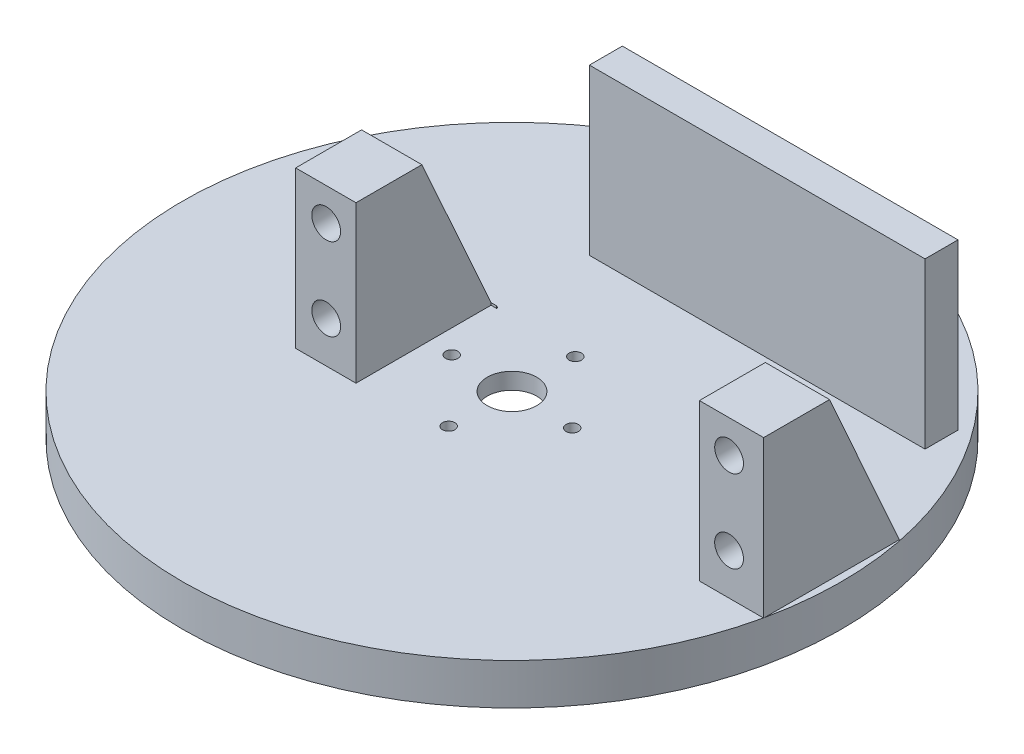
ISO-10303-21;
HEADER;
FILE_DESCRIPTION(('STEP AP214'),'2;1');
FILE_NAME('part.step','',(''),(''),'','','');
FILE_SCHEMA(('AUTOMOTIVE_DESIGN { 1 0 10303 214 1 1 1 1 }'));
ENDSEC;
DATA;
#1=APPLICATION_CONTEXT('core data for automotive mechanical design processes');
#2=APPLICATION_PROTOCOL_DEFINITION('international standard','automotive_design',2000,#1);
#3=PRODUCT_CONTEXT('',#1,'mechanical');
#4=PRODUCT('Part','Part','',(#3));
#5=PRODUCT_RELATED_PRODUCT_CATEGORY('part','',(#4));
#6=PRODUCT_DEFINITION_FORMATION('','',#4);
#7=PRODUCT_DEFINITION_CONTEXT('part definition',#1,'design');
#8=PRODUCT_DEFINITION('design','',#6,#7);
#9=PRODUCT_DEFINITION_SHAPE('','',#8);
#10=(LENGTH_UNIT() NAMED_UNIT(*) SI_UNIT(.MILLI.,.METRE.));
#11=(NAMED_UNIT(*) PLANE_ANGLE_UNIT() SI_UNIT($,.RADIAN.));
#12=(NAMED_UNIT(*) SI_UNIT($,.STERADIAN.) SOLID_ANGLE_UNIT());
#13=UNCERTAINTY_MEASURE_WITH_UNIT(LENGTH_MEASURE(1.E-05),#10,'distance_accuracy_value','');
#14=(GEOMETRIC_REPRESENTATION_CONTEXT(3) GLOBAL_UNCERTAINTY_ASSIGNED_CONTEXT((#13)) GLOBAL_UNIT_ASSIGNED_CONTEXT((#10,
#11,#12)) REPRESENTATION_CONTEXT('',''));
#15=CARTESIAN_POINT('',(0.,0.,0.));
#16=DIRECTION('',(0.,0.,1.));
#17=DIRECTION('',(1.,0.,0.));
#18=AXIS2_PLACEMENT_3D('',#15,#16,#17);
#19=CARTESIAN_POINT('',(-9.64954758475133,23.97,8.60418457702042));
#20=DIRECTION('',(-1.,0.,0.));
#21=DIRECTION('',(0.,0.,1.));
#22=AXIS2_PLACEMENT_3D('',#19,#20,#21);
#23=PLANE('',#22);
#24=DIRECTION('',(0.,1.,0.));
#25=VECTOR('',#24,1.);
#26=CARTESIAN_POINT('',(-9.64954758475133,23.97,-7.78581542297958));
#27=LINE('',#26,#25);
#28=CARTESIAN_POINT('',(-9.64954758475133,5.,-7.78581542297958));
#29=VERTEX_POINT('',#28);
#30=CARTESIAN_POINT('',(-9.64954758475133,5.28005768198521,-7.78581542297958));
#31=VERTEX_POINT('',#30);
#32=EDGE_CURVE('E57',#29,#31,#27,.T.);
#33=ORIENTED_EDGE('',*,*,#32,.F.);
#34=DIRECTION('',(0.,0.,-1.));
#35=VECTOR('',#34,1.);
#36=CARTESIAN_POINT('',(-9.64954758475133,5.,8.60418457702042));
#37=LINE('',#36,#35);
#38=CARTESIAN_POINT('',(-9.64954758475133,5.00000000000001,-7.91153458850054));
#39=VERTEX_POINT('',#38);
#40=EDGE_CURVE('E174',#29,#39,#37,.T.);
#41=ORIENTED_EDGE('',*,*,#40,.T.);
#42=DIRECTION('',(0.,-0.912295115124225,-0.40953342100551));
#43=VECTOR('',#42,1.);
#44=CARTESIAN_POINT('',(-9.64954758475133,23.97,0.604184577020423));
#45=LINE('',#44,#43);
#46=EDGE_CURVE('E242',#31,#39,#45,.T.);
#47=ORIENTED_EDGE('',*,*,#46,.F.);
#48=EDGE_LOOP('',(#33,#41,#47));
#49=FACE_BOUND('',#48,.T.);
#50=ADVANCED_FACE('F35',(#49),#23,.F.);
#51=CARTESIAN_POINT('',(0.,5.,0.));
#52=DIRECTION('',(0.,1.,0.));
#53=DIRECTION('',(0.,0.,1.));
#54=AXIS2_PLACEMENT_3D('',#51,#52,#53);
#55=PLANE('',#54);
#56=ORIENTED_EDGE('',*,*,#40,.F.);
#57=DIRECTION('',(1.,0.,0.));
#58=VECTOR('',#57,1.);
#59=CARTESIAN_POINT('',(-9.60121281858979,5.,-7.78581542297958));
#60=LINE('',#59,#58);
#61=CARTESIAN_POINT('',(-10.328641300271,5.,-7.78581542297958));
#62=VERTEX_POINT('',#61);
#63=EDGE_CURVE('E156',#62,#29,#60,.T.);
#64=ORIENTED_EDGE('',*,*,#63,.F.);
#65=DIRECTION('',(0.,0.,1.));
#66=VECTOR('',#65,1.);
#67=CARTESIAN_POINT('',(-10.328641300271,5.,-7.78581542297958));
#68=LINE('',#67,#66);
#69=CARTESIAN_POINT('',(-10.328641300271,5.,8.60418457702042));
#70=VERTEX_POINT('',#69);
#71=EDGE_CURVE('E163',#62,#70,#68,.T.);
#72=ORIENTED_EDGE('',*,*,#71,.T.);
#73=DIRECTION('',(1.,0.,0.));
#74=VECTOR('',#73,1.);
#75=CARTESIAN_POINT('',(-9.64954758475133,5.,8.60418457702042));
#76=LINE('',#75,#74);
#77=CARTESIAN_POINT('',(-17.6495475847513,5.,8.60418457702042));
#78=VERTEX_POINT('',#77);
#79=EDGE_CURVE('E283',#78,#70,#76,.T.);
#80=ORIENTED_EDGE('',*,*,#79,.F.);
#81=DIRECTION('',(0.,0.,1.));
#82=VECTOR('',#81,1.);
#83=CARTESIAN_POINT('',(-17.6495475847513,5.,8.60418457702042));
#84=LINE('',#83,#82);
#85=CARTESIAN_POINT('',(-17.6495475847513,5.00000000000001,-7.91153458850054));
#86=VERTEX_POINT('',#85);
#87=EDGE_CURVE('E290',#86,#78,#84,.T.);
#88=ORIENTED_EDGE('',*,*,#87,.F.);
#89=DIRECTION('',(-1.,0.,0.));
#90=VECTOR('',#89,1.);
#91=CARTESIAN_POINT('',(-9.64954758475133,5.00000000000001,-7.91153458850054));
#92=LINE('',#91,#90);
#93=EDGE_CURVE('E245',#39,#86,#92,.T.);
#94=ORIENTED_EDGE('',*,*,#93,.F.);
#95=EDGE_LOOP('',(#56,#64,#72,#80,#88,#94));
#96=FACE_BOUND('',#95,.T.);
#97=DIRECTION('',(1.,0.,0.));
#98=VECTOR('',#97,1.);
#99=CARTESIAN_POINT('',(31.0987871814103,5.,8.55500077628189));
#100=LINE('',#99,#98);
#101=CARTESIAN_POINT('',(31.30512446495,5.,8.5550007762819));
#102=VERTEX_POINT('',#101);
#103=CARTESIAN_POINT('',(39.0744412847812,5.,8.55500077628189));
#104=VERTEX_POINT('',#103);
#105=EDGE_CURVE('E273',#102,#104,#100,.T.);
#106=ORIENTED_EDGE('',*,*,#105,.F.);
#107=DIRECTION('',(0.,0.,1.));
#108=VECTOR('',#107,1.);
#109=CARTESIAN_POINT('',(31.30512446495,5.,-7.78581542297958));
#110=LINE('',#109,#108);
#111=CARTESIAN_POINT('',(31.30512446495,5.,-7.78581542297958));
#112=VERTEX_POINT('',#111);
#113=EDGE_CURVE('E177',#112,#102,#110,.T.);
#114=ORIENTED_EDGE('',*,*,#113,.F.);
#115=DIRECTION('',(1.,0.,0.));
#116=VECTOR('',#115,1.);
#117=CARTESIAN_POINT('',(31.0987871814103,5.,-7.78581542297958));
#118=LINE('',#117,#116);
#119=CARTESIAN_POINT('',(31.0987871814103,5.,-7.78581542297958));
#120=VERTEX_POINT('',#119);
#121=EDGE_CURVE('E181',#120,#112,#118,.T.);
#122=ORIENTED_EDGE('',*,*,#121,.F.);
#123=DIRECTION('',(0.,0.,1.));
#124=VECTOR('',#123,1.);
#125=CARTESIAN_POINT('',(31.0987871814103,5.,8.55500077628189));
#126=LINE('',#125,#124);
#127=CARTESIAN_POINT('',(31.0987871814103,5.00000000000001,-7.91153458850054));
#128=VERTEX_POINT('',#127);
#129=EDGE_CURVE('E259',#128,#120,#126,.T.);
#130=ORIENTED_EDGE('',*,*,#129,.F.);
#131=DIRECTION('',(1.,0.,0.));
#132=VECTOR('',#131,1.);
#133=CARTESIAN_POINT('',(31.0987871814103,5.00000000000001,-7.91153458850054));
#134=LINE('',#133,#132);
#135=CARTESIAN_POINT('',(39.0987871814103,5.00000000000001,-7.91153458850054));
#136=VERTEX_POINT('',#135);
#137=EDGE_CURVE('E254',#128,#136,#134,.T.);
#138=ORIENTED_EDGE('',*,*,#137,.T.);
#139=DIRECTION('',(0.,0.,-1.));
#140=VECTOR('',#139,1.);
#141=CARTESIAN_POINT('',(39.0987871814103,5.,8.55500077628189));
#142=LINE('',#141,#140);
#143=CARTESIAN_POINT('',(39.0987871814103,5.,8.44303505516735));
#144=VERTEX_POINT('',#143);
#145=EDGE_CURVE('E275',#144,#136,#142,.T.);
#146=ORIENTED_EDGE('',*,*,#145,.F.);
#147=CARTESIAN_POINT('',(0.,5.,0.));
#148=DIRECTION('',(0.,1.,0.));
#149=DIRECTION('',(0.,0.,1.));
#150=AXIS2_PLACEMENT_3D('',#147,#148,#149);
#151=CIRCLE('',#150,40.);
#152=EDGE_CURVE('E326',#144,#104,#151,.T.);
#153=ORIENTED_EDGE('',*,*,#152,.T.);
#154=EDGE_LOOP('',(#106,#114,#122,#130,#138,#146,#153));
#155=FACE_BOUND('',#154,.T.);
#156=CARTESIAN_POINT('',(-0.185951444288439,5.,7.49769444965397));
#157=DIRECTION('',(0.,1.,0.));
#158=DIRECTION('',(0.,0.,1.));
#159=AXIS2_PLACEMENT_3D('',#156,#157,#158);
#160=CIRCLE('',#159,0.749999999999999);
#161=CARTESIAN_POINT('',(-0.185951444288439,5.,8.24769444965397));
#162=VERTEX_POINT('',#161);
#163=EDGE_CURVE('E312',#162,#162,#160,.T.);
#164=ORIENTED_EDGE('',*,*,#163,.F.);
#165=EDGE_LOOP('',(#164));
#166=FACE_BOUND('',#165,.T.);
#167=CARTESIAN_POINT('',(7.49769444965355,5.,0.185951444288668));
#168=DIRECTION('',(0.,1.,0.));
#169=DIRECTION('',(0.,0.,1.));
#170=AXIS2_PLACEMENT_3D('',#167,#168,#169);
#171=CIRCLE('',#170,0.75);
#172=CARTESIAN_POINT('',(7.49769444965355,5.,0.935951444288668));
#173=VERTEX_POINT('',#172);
#174=EDGE_CURVE('E308',#173,#173,#171,.T.);
#175=ORIENTED_EDGE('',*,*,#174,.F.);
#176=EDGE_LOOP('',(#175));
#177=FACE_BOUND('',#176,.T.);
#178=CARTESIAN_POINT('',(0.185951444288244,5.,-7.49769444965332));
#179=DIRECTION('',(0.,1.,0.));
#180=DIRECTION('',(0.,0.,1.));
#181=AXIS2_PLACEMENT_3D('',#178,#179,#180);
#182=CIRCLE('',#181,0.749999999999999);
#183=CARTESIAN_POINT('',(0.185951444288244,5.,-6.74769444965332));
#184=VERTEX_POINT('',#183);
#185=EDGE_CURVE('E304',#184,#184,#182,.T.);
#186=ORIENTED_EDGE('',*,*,#185,.F.);
#187=EDGE_LOOP('',(#186));
#188=FACE_BOUND('',#187,.T.);
#189=CARTESIAN_POINT('',(-7.49769444965374,5.,-0.185951444288015));
#190=DIRECTION('',(0.,1.,0.));
#191=DIRECTION('',(0.,0.,1.));
#192=AXIS2_PLACEMENT_3D('',#189,#190,#191);
#193=CIRCLE('',#192,0.749999999999999);
#194=CARTESIAN_POINT('',(-7.49769444965374,5.,0.564048555711984));
#195=VERTEX_POINT('',#194);
#196=EDGE_CURVE('E300',#195,#195,#193,.T.);
#197=ORIENTED_EDGE('',*,*,#196,.F.);
#198=EDGE_LOOP('',(#197));
#199=FACE_BOUND('',#198,.T.);
#200=CARTESIAN_POINT('',(0.,5.,3.2612801348364E-13));
#201=DIRECTION('',(0.,1.,0.));
#202=DIRECTION('',(0.,0.,1.));
#203=AXIS2_PLACEMENT_3D('',#200,#201,#202);
#204=CIRCLE('',#203,3.);
#205=CARTESIAN_POINT('',(0.,5.,3.00000000000033));
#206=VERTEX_POINT('',#205);
#207=EDGE_CURVE('E296',#206,#206,#204,.T.);
#208=ORIENTED_EDGE('',*,*,#207,.F.);
#209=EDGE_LOOP('',(#208));
#210=FACE_BOUND('',#209,.T.);
#211=DIRECTION('',(1.,0.,0.));
#212=VECTOR('',#211,1.);
#213=CARTESIAN_POINT('',(-9.60121281858979,5.,-18.9982727904565));
#214=LINE('',#213,#212);
#215=CARTESIAN_POINT('',(-9.60121281858979,5.,-18.9982727904565));
#216=VERTEX_POINT('',#215);
#217=CARTESIAN_POINT('',(31.1368316095642,5.,-18.9982727904565));
#218=VERTEX_POINT('',#217);
#219=EDGE_CURVE('E211',#216,#218,#214,.T.);
#220=ORIENTED_EDGE('',*,*,#219,.F.);
#221=DIRECTION('',(0.,0.,1.));
#222=VECTOR('',#221,1.);
#223=CARTESIAN_POINT('',(-9.60121281858979,5.,-18.9982727904565));
#224=LINE('',#223,#222);
#225=CARTESIAN_POINT('',(-9.60121281858979,5.,-22.9982727904565));
#226=VERTEX_POINT('',#225);
#227=EDGE_CURVE('E197',#226,#216,#224,.T.);
#228=ORIENTED_EDGE('',*,*,#227,.F.);
#229=DIRECTION('',(-1.,0.,0.));
#230=VECTOR('',#229,1.);
#231=CARTESIAN_POINT('',(-9.60121281858979,5.,-22.9982727904565));
#232=LINE('',#231,#230);
#233=CARTESIAN_POINT('',(31.1368316095642,5.,-22.9982727904565));
#234=VERTEX_POINT('',#233);
#235=EDGE_CURVE('E202',#234,#226,#232,.T.);
#236=ORIENTED_EDGE('',*,*,#235,.F.);
#237=DIRECTION('',(0.,0.,-1.));
#238=VECTOR('',#237,1.);
#239=CARTESIAN_POINT('',(31.1368316095642,5.,-18.9982727904565));
#240=LINE('',#239,#238);
#241=EDGE_CURVE('E213',#218,#234,#240,.T.);
#242=ORIENTED_EDGE('',*,*,#241,.F.);
#243=EDGE_LOOP('',(#220,#228,#236,#242));
#244=FACE_BOUND('',#243,.T.);
#245=ADVANCED_FACE('F171',(#96,#155,#166,#177,#188,#199,#210,#244),#55,.T.);
#246=CARTESIAN_POINT('',(0.,5.,0.));
#247=DIRECTION('',(0.,-1.,0.));
#248=DIRECTION('',(0.,0.,-1.));
#249=AXIS2_PLACEMENT_3D('',#246,#247,#248);
#250=CYLINDRICAL_SURFACE('',#249,40.);
#251=EDGE_CURVE('E322',#104,#144,#151,.T.);
#252=ORIENTED_EDGE('',*,*,#251,.F.);
#253=ORIENTED_EDGE('',*,*,#152,.F.);
#254=EDGE_LOOP('',(#252,#253));
#255=FACE_BOUND('',#254,.T.);
#256=CARTESIAN_POINT('',(0.,0.,0.));
#257=DIRECTION('',(0.,1.,0.));
#258=DIRECTION('',(0.,0.,1.));
#259=AXIS2_PLACEMENT_3D('',#256,#257,#258);
#260=CIRCLE('',#259,40.);
#261=CARTESIAN_POINT('',(0.,0.,40.));
#262=VERTEX_POINT('',#261);
#263=EDGE_CURVE('E319',#262,#262,#260,.T.);
#264=ORIENTED_EDGE('',*,*,#263,.T.);
#265=EDGE_LOOP('',(#264));
#266=FACE_BOUND('',#265,.T.);
#267=ADVANCED_FACE('F37',(#255,#266),#250,.T.);
#268=CARTESIAN_POINT('',(0.,0.,0.));
#269=DIRECTION('',(0.,1.,0.));
#270=DIRECTION('',(0.,0.,1.));
#271=AXIS2_PLACEMENT_3D('',#268,#269,#270);
#272=PLANE('',#271);
#273=CARTESIAN_POINT('',(0.,0.,0.));
#274=DIRECTION('',(0.,-1.,0.));
#275=DIRECTION('',(0.,0.,-1.));
#276=AXIS2_PLACEMENT_3D('',#273,#274,#275);
#277=CIRCLE('',#276,10.75);
#278=CARTESIAN_POINT('',(0.,0.,-10.75));
#279=VERTEX_POINT('',#278);
#280=EDGE_CURVE('E315',#279,#279,#277,.T.);
#281=ORIENTED_EDGE('',*,*,#280,.F.);
#282=EDGE_LOOP('',(#281));
#283=FACE_BOUND('',#282,.T.);
#284=ORIENTED_EDGE('',*,*,#263,.F.);
#285=EDGE_LOOP('',(#284));
#286=FACE_BOUND('',#285,.T.);
#287=ADVANCED_FACE('F386',(#283,#286),#272,.F.);
#288=CARTESIAN_POINT('',(0.,3.,0.));
#289=DIRECTION('',(0.,-1.,0.));
#290=DIRECTION('',(0.,0.,-1.));
#291=AXIS2_PLACEMENT_3D('',#288,#289,#290);
#292=CYLINDRICAL_SURFACE('',#291,10.75);
#293=CARTESIAN_POINT('',(0.,3.,0.));
#294=DIRECTION('',(0.,-1.,0.));
#295=DIRECTION('',(0.,0.,-1.));
#296=AXIS2_PLACEMENT_3D('',#293,#294,#295);
#297=CIRCLE('',#296,10.75);
#298=CARTESIAN_POINT('',(0.,3.,-10.75));
#299=VERTEX_POINT('',#298);
#300=EDGE_CURVE('E316',#299,#299,#297,.T.);
#301=ORIENTED_EDGE('',*,*,#300,.F.);
#302=EDGE_LOOP('',(#301));
#303=FACE_BOUND('',#302,.T.);
#304=ORIENTED_EDGE('',*,*,#280,.T.);
#305=EDGE_LOOP('',(#304));
#306=FACE_BOUND('',#305,.T.);
#307=ADVANCED_FACE('F390',(#303,#306),#292,.F.);
#308=CARTESIAN_POINT('',(0.,3.,0.));
#309=DIRECTION('',(0.,-1.,0.));
#310=DIRECTION('',(0.,0.,-1.));
#311=AXIS2_PLACEMENT_3D('',#308,#309,#310);
#312=PLANE('',#311);
#313=CARTESIAN_POINT('',(-0.185951444288439,3.,7.49769444965397));
#314=DIRECTION('',(0.,-1.,0.));
#315=DIRECTION('',(0.,0.,-1.));
#316=AXIS2_PLACEMENT_3D('',#313,#314,#315);
#317=CIRCLE('',#316,0.749999999999999);
#318=CARTESIAN_POINT('',(-0.185951444288439,3.,6.74769444965397));
#319=VERTEX_POINT('',#318);
#320=EDGE_CURVE('E311',#319,#319,#317,.T.);
#321=ORIENTED_EDGE('',*,*,#320,.F.);
#322=EDGE_LOOP('',(#321));
#323=FACE_BOUND('',#322,.T.);
#324=CARTESIAN_POINT('',(7.49769444965355,3.,0.185951444288668));
#325=DIRECTION('',(0.,-1.,0.));
#326=DIRECTION('',(0.,0.,-1.));
#327=AXIS2_PLACEMENT_3D('',#324,#325,#326);
#328=CIRCLE('',#327,0.75);
#329=CARTESIAN_POINT('',(7.49769444965355,3.,-0.564048555711333));
#330=VERTEX_POINT('',#329);
#331=EDGE_CURVE('E307',#330,#330,#328,.T.);
#332=ORIENTED_EDGE('',*,*,#331,.F.);
#333=EDGE_LOOP('',(#332));
#334=FACE_BOUND('',#333,.T.);
#335=CARTESIAN_POINT('',(0.185951444288244,3.,-7.49769444965332));
#336=DIRECTION('',(0.,-1.,0.));
#337=DIRECTION('',(0.,0.,-1.));
#338=AXIS2_PLACEMENT_3D('',#335,#336,#337);
#339=CIRCLE('',#338,0.749999999999999);
#340=CARTESIAN_POINT('',(0.185951444288244,3.,-8.24769444965332));
#341=VERTEX_POINT('',#340);
#342=EDGE_CURVE('E303',#341,#341,#339,.T.);
#343=ORIENTED_EDGE('',*,*,#342,.F.);
#344=EDGE_LOOP('',(#343));
#345=FACE_BOUND('',#344,.T.);
#346=CARTESIAN_POINT('',(-7.49769444965374,3.,-0.185951444288015));
#347=DIRECTION('',(0.,-1.,0.));
#348=DIRECTION('',(0.,0.,-1.));
#349=AXIS2_PLACEMENT_3D('',#346,#347,#348);
#350=CIRCLE('',#349,0.749999999999999);
#351=CARTESIAN_POINT('',(-7.49769444965374,3.,-0.935951444288015));
#352=VERTEX_POINT('',#351);
#353=EDGE_CURVE('E299',#352,#352,#350,.T.);
#354=ORIENTED_EDGE('',*,*,#353,.F.);
#355=EDGE_LOOP('',(#354));
#356=FACE_BOUND('',#355,.T.);
#357=CARTESIAN_POINT('',(0.,3.,3.2612801348364E-13));
#358=DIRECTION('',(0.,-1.,0.));
#359=DIRECTION('',(0.,0.,-1.));
#360=AXIS2_PLACEMENT_3D('',#357,#358,#359);
#361=CIRCLE('',#360,3.);
#362=CARTESIAN_POINT('',(0.,3.,-2.99999999999968));
#363=VERTEX_POINT('',#362);
#364=EDGE_CURVE('E295',#363,#363,#361,.T.);
#365=ORIENTED_EDGE('',*,*,#364,.F.);
#366=EDGE_LOOP('',(#365));
#367=FACE_BOUND('',#366,.T.);
#368=ORIENTED_EDGE('',*,*,#300,.T.);
#369=EDGE_LOOP('',(#368));
#370=FACE_BOUND('',#369,.T.);
#371=ADVANCED_FACE('F395',(#323,#334,#345,#356,#367,#370),#312,.T.);
#372=CARTESIAN_POINT('',(0.,13.,3.2612801348364E-13));
#373=DIRECTION('',(0.,-1.,0.));
#374=DIRECTION('',(0.,0.,-1.));
#375=AXIS2_PLACEMENT_3D('',#372,#373,#374);
#376=CYLINDRICAL_SURFACE('',#375,3.);
#377=ORIENTED_EDGE('',*,*,#207,.T.);
#378=EDGE_LOOP('',(#377));
#379=FACE_BOUND('',#378,.T.);
#380=ORIENTED_EDGE('',*,*,#364,.T.);
#381=EDGE_LOOP('',(#380));
#382=FACE_BOUND('',#381,.T.);
#383=ADVANCED_FACE('F418',(#379,#382),#376,.F.);
#384=CARTESIAN_POINT('',(-7.49769444965374,13.,-0.185951444288015));
#385=DIRECTION('',(0.,-1.,0.));
#386=DIRECTION('',(0.,0.,-1.));
#387=AXIS2_PLACEMENT_3D('',#384,#385,#386);
#388=CYLINDRICAL_SURFACE('',#387,0.749999999999999);
#389=ORIENTED_EDGE('',*,*,#196,.T.);
#390=EDGE_LOOP('',(#389));
#391=FACE_BOUND('',#390,.T.);
#392=ORIENTED_EDGE('',*,*,#353,.T.);
#393=EDGE_LOOP('',(#392));
#394=FACE_BOUND('',#393,.T.);
#395=ADVANCED_FACE('F414',(#391,#394),#388,.F.);
#396=CARTESIAN_POINT('',(0.185951444288244,13.,-7.49769444965332));
#397=DIRECTION('',(0.,-1.,0.));
#398=DIRECTION('',(0.,0.,-1.));
#399=AXIS2_PLACEMENT_3D('',#396,#397,#398);
#400=CYLINDRICAL_SURFACE('',#399,0.749999999999999);
#401=ORIENTED_EDGE('',*,*,#185,.T.);
#402=EDGE_LOOP('',(#401));
#403=FACE_BOUND('',#402,.T.);
#404=ORIENTED_EDGE('',*,*,#342,.T.);
#405=EDGE_LOOP('',(#404));
#406=FACE_BOUND('',#405,.T.);
#407=ADVANCED_FACE('F410',(#403,#406),#400,.F.);
#408=CARTESIAN_POINT('',(7.49769444965355,13.,0.185951444288668));
#409=DIRECTION('',(0.,-1.,0.));
#410=DIRECTION('',(0.,0.,-1.));
#411=AXIS2_PLACEMENT_3D('',#408,#409,#410);
#412=CYLINDRICAL_SURFACE('',#411,0.75);
#413=ORIENTED_EDGE('',*,*,#174,.T.);
#414=EDGE_LOOP('',(#413));
#415=FACE_BOUND('',#414,.T.);
#416=ORIENTED_EDGE('',*,*,#331,.T.);
#417=EDGE_LOOP('',(#416));
#418=FACE_BOUND('',#417,.T.);
#419=ADVANCED_FACE('F413',(#415,#418),#412,.F.);
#420=CARTESIAN_POINT('',(-0.185951444288439,13.,7.49769444965397));
#421=DIRECTION('',(0.,-1.,0.));
#422=DIRECTION('',(0.,0.,-1.));
#423=AXIS2_PLACEMENT_3D('',#420,#421,#422);
#424=CYLINDRICAL_SURFACE('',#423,0.749999999999999);
#425=ORIENTED_EDGE('',*,*,#163,.T.);
#426=EDGE_LOOP('',(#425));
#427=FACE_BOUND('',#426,.T.);
#428=ORIENTED_EDGE('',*,*,#320,.T.);
#429=EDGE_LOOP('',(#428));
#430=FACE_BOUND('',#429,.T.);
#431=ADVANCED_FACE('F420',(#427,#430),#424,.F.);
#432=CARTESIAN_POINT('',(-17.6495475847513,23.97,8.60418457702042));
#433=DIRECTION('',(1.,0.,0.));
#434=DIRECTION('',(0.,0.,-1.));
#435=AXIS2_PLACEMENT_3D('',#432,#433,#434);
#436=PLANE('',#435);
#437=ORIENTED_EDGE('',*,*,#87,.T.);
#438=DIRECTION('',(0.,-1.,0.));
#439=VECTOR('',#438,1.);
#440=CARTESIAN_POINT('',(-17.6495475847513,23.97,8.60418457702042));
#441=LINE('',#440,#439);
#442=CARTESIAN_POINT('',(-17.6495475847513,23.97,8.60418457702042));
#443=VERTEX_POINT('',#442);
#444=EDGE_CURVE('E288',#443,#78,#441,.T.);
#445=ORIENTED_EDGE('',*,*,#444,.F.);
#446=DIRECTION('',(0.,0.,1.));
#447=VECTOR('',#446,1.);
#448=CARTESIAN_POINT('',(-17.6495475847513,23.97,8.60418457702042));
#449=LINE('',#448,#447);
#450=CARTESIAN_POINT('',(-17.6495475847513,23.97,0.604184577020423));
#451=VERTEX_POINT('',#450);
#452=EDGE_CURVE('E282',#451,#443,#449,.T.);
#453=ORIENTED_EDGE('',*,*,#452,.F.);
#454=DIRECTION('',(0.,-0.912295115124225,-0.40953342100551));
#455=VECTOR('',#454,1.);
#456=CARTESIAN_POINT('',(-17.6495475847513,23.97,0.604184577020423));
#457=LINE('',#456,#455);
#458=EDGE_CURVE('E241',#451,#86,#457,.T.);
#459=ORIENTED_EDGE('',*,*,#458,.T.);
#460=EDGE_LOOP('',(#437,#445,#453,#459));
#461=FACE_BOUND('',#460,.T.);
#462=ADVANCED_FACE('F408',(#461),#436,.F.);
#463=CARTESIAN_POINT('',(-9.64954758475133,23.97,8.60418457702042));
#464=DIRECTION('',(0.,0.,-1.));
#465=DIRECTION('',(-1.,0.,0.));
#466=AXIS2_PLACEMENT_3D('',#463,#464,#465);
#467=PLANE('',#466);
#468=CARTESIAN_POINT('',(-13.9441755160392,10.,8.60418457702042));
#469=DIRECTION('',(0.,0.,1.));
#470=DIRECTION('',(1.,0.,0.));
#471=AXIS2_PLACEMENT_3D('',#468,#469,#470);
#472=CIRCLE('',#471,1.75);
#473=CARTESIAN_POINT('',(-12.1941755160392,10.,8.60418457702042));
#474=VERTEX_POINT('',#473);
#475=EDGE_CURVE('E226',#474,#474,#472,.T.);
#476=ORIENTED_EDGE('',*,*,#475,.F.);
#477=EDGE_LOOP('',(#476));
#478=FACE_BOUND('',#477,.T.);
#479=CARTESIAN_POINT('',(-13.9441755160392,20.,8.60418457702042));
#480=DIRECTION('',(0.,0.,1.));
#481=DIRECTION('',(1.,0.,0.));
#482=AXIS2_PLACEMENT_3D('',#479,#480,#481);
#483=CIRCLE('',#482,1.75);
#484=CARTESIAN_POINT('',(-12.1941755160392,20.,8.60418457702042));
#485=VERTEX_POINT('',#484);
#486=EDGE_CURVE('E229',#485,#485,#483,.T.);
#487=ORIENTED_EDGE('',*,*,#486,.F.);
#488=EDGE_LOOP('',(#487));
#489=FACE_BOUND('',#488,.T.);
#490=ORIENTED_EDGE('',*,*,#79,.T.);
#491=DIRECTION('',(0.,-1.,0.));
#492=VECTOR('',#491,1.);
#493=CARTESIAN_POINT('',(-10.328641300271,5.,8.60418457702042));
#494=LINE('',#493,#492);
#495=CARTESIAN_POINT('',(-10.328641300271,23.97,8.60418457702042));
#496=VERTEX_POINT('',#495);
#497=EDGE_CURVE('E160',#496,#70,#494,.T.);
#498=ORIENTED_EDGE('',*,*,#497,.F.);
#499=DIRECTION('',(1.,0.,0.));
#500=VECTOR('',#499,1.);
#501=CARTESIAN_POINT('',(-9.64954758475133,23.97,8.60418457702042));
#502=LINE('',#501,#500);
#503=EDGE_CURVE('E285',#443,#496,#502,.T.);
#504=ORIENTED_EDGE('',*,*,#503,.F.);
#505=ORIENTED_EDGE('',*,*,#444,.T.);
#506=EDGE_LOOP('',(#490,#498,#504,#505));
#507=FACE_BOUND('',#506,.T.);
#508=ADVANCED_FACE('F480',(#478,#489,#507),#467,.F.);
#509=CARTESIAN_POINT('',(0.,23.97,0.));
#510=DIRECTION('',(0.,1.,0.));
#511=DIRECTION('',(0.,0.,1.));
#512=AXIS2_PLACEMENT_3D('',#509,#510,#511);
#513=PLANE('',#512);
#514=DIRECTION('',(0.,0.,1.));
#515=VECTOR('',#514,1.);
#516=CARTESIAN_POINT('',(-10.328641300271,23.97,0.));
#517=LINE('',#516,#515);
#518=CARTESIAN_POINT('',(-10.328641300271,23.97,0.604184577020423));
#519=VERTEX_POINT('',#518);
#520=EDGE_CURVE('E186',#519,#496,#517,.T.);
#521=ORIENTED_EDGE('',*,*,#520,.F.);
#522=DIRECTION('',(-1.,0.,0.));
#523=VECTOR('',#522,1.);
#524=CARTESIAN_POINT('',(-9.64954758475133,23.97,0.604184577020422));
#525=LINE('',#524,#523);
#526=EDGE_CURVE('E280',#519,#451,#525,.T.);
#527=ORIENTED_EDGE('',*,*,#526,.T.);
#528=ORIENTED_EDGE('',*,*,#452,.T.);
#529=ORIENTED_EDGE('',*,*,#503,.T.);
#530=EDGE_LOOP('',(#521,#527,#528,#529));
#531=FACE_BOUND('',#530,.T.);
#532=ADVANCED_FACE('F489',(#531),#513,.T.);
#533=CARTESIAN_POINT('',(31.0987871814103,23.97,8.55500077628189));
#534=DIRECTION('',(1.,0.,0.));
#535=DIRECTION('',(0.,0.,-1.));
#536=AXIS2_PLACEMENT_3D('',#533,#534,#535);
#537=PLANE('',#536);
#538=ORIENTED_EDGE('',*,*,#129,.T.);
#539=DIRECTION('',(0.,-1.,0.));
#540=VECTOR('',#539,1.);
#541=CARTESIAN_POINT('',(31.0987871814103,5.,-7.78581542297958));
#542=LINE('',#541,#540);
#543=CARTESIAN_POINT('',(31.0987871814103,5.28168459318708,-7.78581542297958));
#544=VERTEX_POINT('',#543);
#545=EDGE_CURVE('E179',#544,#120,#542,.T.);
#546=ORIENTED_EDGE('',*,*,#545,.F.);
#547=DIRECTION('',(0.,0.913177562052676,0.407561946412482));
#548=VECTOR('',#547,1.);
#549=CARTESIAN_POINT('',(31.0987871814103,23.97,0.555000776281892));
#550=LINE('',#549,#548);
#551=EDGE_CURVE('E251',#128,#544,#550,.T.);
#552=ORIENTED_EDGE('',*,*,#551,.F.);
#553=EDGE_LOOP('',(#538,#546,#552));
#554=FACE_BOUND('',#553,.T.);
#555=ADVANCED_FACE('F360',(#554),#537,.F.);
#556=CARTESIAN_POINT('',(31.0987871814103,23.97,8.55500077628189));
#557=DIRECTION('',(0.,0.,-1.));
#558=DIRECTION('',(-1.,0.,0.));
#559=AXIS2_PLACEMENT_3D('',#556,#557,#558);
#560=PLANE('',#559);
#561=CARTESIAN_POINT('',(34.9087871814103,19.9999999999999,8.55500077628189));
#562=DIRECTION('',(0.,0.,-1.));
#563=DIRECTION('',(-1.,0.,0.));
#564=AXIS2_PLACEMENT_3D('',#561,#562,#563);
#565=CIRCLE('',#564,1.75);
#566=CARTESIAN_POINT('',(33.1587871814103,19.9999999999999,8.55500077628189));
#567=VERTEX_POINT('',#566);
#568=EDGE_CURVE('E238',#567,#567,#565,.T.);
#569=ORIENTED_EDGE('',*,*,#568,.T.);
#570=EDGE_LOOP('',(#569));
#571=FACE_BOUND('',#570,.T.);
#572=CARTESIAN_POINT('',(34.9041592501224,9.99999999999991,8.55500077628189));
#573=DIRECTION('',(0.,0.,-1.));
#574=DIRECTION('',(-1.,0.,0.));
#575=AXIS2_PLACEMENT_3D('',#572,#573,#574);
#576=CIRCLE('',#575,1.75);
#577=CARTESIAN_POINT('',(33.1541592501224,9.99999999999991,8.55500077628189));
#578=VERTEX_POINT('',#577);
#579=EDGE_CURVE('E233',#578,#578,#576,.T.);
#580=ORIENTED_EDGE('',*,*,#579,.T.);
#581=EDGE_LOOP('',(#580));
#582=FACE_BOUND('',#581,.T.);
#583=DIRECTION('',(1.,0.,0.));
#584=VECTOR('',#583,1.);
#585=CARTESIAN_POINT('',(31.0987871814103,23.97,8.55500077628189));
#586=LINE('',#585,#584);
#587=CARTESIAN_POINT('',(31.30512446495,23.97,8.55500077628189));
#588=VERTEX_POINT('',#587);
#589=CARTESIAN_POINT('',(39.0987871814103,23.97,8.55500077628189));
#590=VERTEX_POINT('',#589);
#591=EDGE_CURVE('E260',#588,#590,#586,.T.);
#592=ORIENTED_EDGE('',*,*,#591,.F.);
#593=DIRECTION('',(0.,-1.,0.));
#594=VECTOR('',#593,1.);
#595=CARTESIAN_POINT('',(31.30512446495,23.97,8.55500077628189));
#596=LINE('',#595,#594);
#597=EDGE_CURVE('E191',#588,#102,#596,.T.);
#598=ORIENTED_EDGE('',*,*,#597,.T.);
#599=ORIENTED_EDGE('',*,*,#105,.T.);
#600=CARTESIAN_POINT('',(39.0987871814103,5.,8.55500077628189));
#601=VERTEX_POINT('',#600);
#602=EDGE_CURVE('E272',#104,#601,#100,.T.);
#603=ORIENTED_EDGE('',*,*,#602,.T.);
#604=DIRECTION('',(0.,-1.,0.));
#605=VECTOR('',#604,1.);
#606=CARTESIAN_POINT('',(39.0987871814103,23.97,8.55500077628189));
#607=LINE('',#606,#605);
#608=EDGE_CURVE('E269',#590,#601,#607,.T.);
#609=ORIENTED_EDGE('',*,*,#608,.F.);
#610=EDGE_LOOP('',(#592,#598,#599,#603,#609));
#611=FACE_BOUND('',#610,.T.);
#612=ADVANCED_FACE('F504',(#571,#582,#611),#560,.F.);
#613=CARTESIAN_POINT('',(39.0987871814103,23.97,8.55500077628189));
#614=DIRECTION('',(-1.,0.,0.));
#615=DIRECTION('',(0.,0.,1.));
#616=AXIS2_PLACEMENT_3D('',#613,#614,#615);
#617=PLANE('',#616);
#618=EDGE_CURVE('E263',#601,#144,#142,.T.);
#619=ORIENTED_EDGE('',*,*,#618,.T.);
#620=ORIENTED_EDGE('',*,*,#145,.T.);
#621=DIRECTION('',(0.,0.913177562052676,0.407561946412482));
#622=VECTOR('',#621,1.);
#623=CARTESIAN_POINT('',(39.0987871814103,23.97,0.555000776281892));
#624=LINE('',#623,#622);
#625=CARTESIAN_POINT('',(39.0987871814103,23.97,0.555000776281892));
#626=VERTEX_POINT('',#625);
#627=EDGE_CURVE('E250',#136,#626,#624,.T.);
#628=ORIENTED_EDGE('',*,*,#627,.T.);
#629=DIRECTION('',(0.,0.,-1.));
#630=VECTOR('',#629,1.);
#631=CARTESIAN_POINT('',(39.0987871814103,23.97,8.55500077628189));
#632=LINE('',#631,#630);
#633=EDGE_CURVE('E262',#590,#626,#632,.T.);
#634=ORIENTED_EDGE('',*,*,#633,.F.);
#635=ORIENTED_EDGE('',*,*,#608,.T.);
#636=EDGE_LOOP('',(#619,#620,#628,#634,#635));
#637=FACE_BOUND('',#636,.T.);
#638=ADVANCED_FACE('F377',(#637),#617,.F.);
#639=CARTESIAN_POINT('',(0.,23.97,0.));
#640=DIRECTION('',(0.,-1.,0.));
#641=DIRECTION('',(0.,0.,-1.));
#642=AXIS2_PLACEMENT_3D('',#639,#640,#641);
#643=PLANE('',#642);
#644=DIRECTION('',(-1.,0.,0.));
#645=VECTOR('',#644,1.);
#646=CARTESIAN_POINT('',(31.0987871814103,23.97,0.555000776281893));
#647=LINE('',#646,#645);
#648=CARTESIAN_POINT('',(31.30512446495,23.97,0.555000776281893));
#649=VERTEX_POINT('',#648);
#650=EDGE_CURVE('E266',#626,#649,#647,.T.);
#651=ORIENTED_EDGE('',*,*,#650,.T.);
#652=DIRECTION('',(0.,0.,1.));
#653=VECTOR('',#652,1.);
#654=CARTESIAN_POINT('',(31.30512446495,23.97,0.));
#655=LINE('',#654,#653);
#656=EDGE_CURVE('E188',#649,#588,#655,.T.);
#657=ORIENTED_EDGE('',*,*,#656,.T.);
#658=ORIENTED_EDGE('',*,*,#591,.T.);
#659=ORIENTED_EDGE('',*,*,#633,.T.);
#660=EDGE_LOOP('',(#651,#657,#658,#659));
#661=FACE_BOUND('',#660,.T.);
#662=ADVANCED_FACE('F372',(#661),#643,.F.);
#663=CARTESIAN_POINT('',(0.,5.,0.));
#664=DIRECTION('',(0.,-1.,0.));
#665=DIRECTION('',(0.,0.,-1.));
#666=AXIS2_PLACEMENT_3D('',#663,#664,#665);
#667=PLANE('',#666);
#668=ORIENTED_EDGE('',*,*,#251,.T.);
#669=ORIENTED_EDGE('',*,*,#618,.F.);
#670=ORIENTED_EDGE('',*,*,#602,.F.);
#671=EDGE_LOOP('',(#668,#669,#670));
#672=FACE_BOUND('',#671,.T.);
#673=ADVANCED_FACE('F381',(#672),#667,.T.);
#674=CARTESIAN_POINT('',(31.0987871814103,23.97,0.555000776281892));
#675=DIRECTION('',(0.,0.407561946412482,-0.913177562052676));
#676=DIRECTION('',(0.,0.913177562052676,0.407561946412482));
#677=AXIS2_PLACEMENT_3D('',#674,#675,#676);
#678=PLANE('',#677);
#679=DIRECTION('',(0.,-0.913177562052676,-0.407561946412482));
#680=VECTOR('',#679,1.);
#681=CARTESIAN_POINT('',(31.30512446495,23.97,0.555000776281892));
#682=LINE('',#681,#680);
#683=CARTESIAN_POINT('',(31.30512446495,5.28168459318708,-7.78581542297958));
#684=VERTEX_POINT('',#683);
#685=EDGE_CURVE('E11',#649,#684,#682,.T.);
#686=ORIENTED_EDGE('',*,*,#685,.F.);
#687=ORIENTED_EDGE('',*,*,#650,.F.);
#688=ORIENTED_EDGE('',*,*,#627,.F.);
#689=ORIENTED_EDGE('',*,*,#137,.F.);
#690=ORIENTED_EDGE('',*,*,#551,.T.);
#691=DIRECTION('',(-1.,0.,0.));
#692=VECTOR('',#691,1.);
#693=CARTESIAN_POINT('',(31.0987871814103,5.28168459318708,-7.78581542297958));
#694=LINE('',#693,#692);
#695=EDGE_CURVE('E43',#684,#544,#694,.T.);
#696=ORIENTED_EDGE('',*,*,#695,.F.);
#697=EDGE_LOOP('',(#686,#687,#688,#689,#690,#696));
#698=FACE_BOUND('',#697,.T.);
#699=CARTESIAN_POINT('',(34.9087871814103,19.9999999999999,-1.2168571782878));
#700=DIRECTION('',(0.,0.407561946412482,-0.913177562052676));
#701=DIRECTION('',(0.,0.913177562052676,0.407561946412482));
#702=AXIS2_PLACEMENT_3D('',#699,#700,#701);
#703=ELLIPSE('',#702,1.91638523844835,1.75);
#704=CARTESIAN_POINT('',(34.9087871814103,21.7499999999999,-0.435811480429643));
#705=VERTEX_POINT('',#704);
#706=EDGE_CURVE('E236',#705,#705,#703,.T.);
#707=ORIENTED_EDGE('',*,*,#706,.F.);
#708=EDGE_LOOP('',(#707));
#709=FACE_BOUND('',#708,.T.);
#710=CARTESIAN_POINT('',(34.9041592501224,9.99999999999991,-5.67997545176299));
#711=DIRECTION('',(0.,0.407561946412482,-0.913177562052676));
#712=DIRECTION('',(0.,0.913177562052676,0.407561946412482));
#713=AXIS2_PLACEMENT_3D('',#710,#711,#712);
#714=ELLIPSE('',#713,1.91638523844835,1.75);
#715=CARTESIAN_POINT('',(34.9041592501224,11.7499999999999,-4.89892975390483));
#716=VERTEX_POINT('',#715);
#717=EDGE_CURVE('E237',#716,#716,#714,.T.);
#718=ORIENTED_EDGE('',*,*,#717,.F.);
#719=EDGE_LOOP('',(#718));
#720=FACE_BOUND('',#719,.T.);
#721=ADVANCED_FACE('F362',(#698,#709,#720),#678,.T.);
#722=CARTESIAN_POINT('',(-9.64954758475133,23.97,0.604184577020423));
#723=DIRECTION('',(0.,0.40953342100551,-0.912295115124225));
#724=DIRECTION('',(0.,0.912295115124225,0.40953342100551));
#725=AXIS2_PLACEMENT_3D('',#722,#723,#724);
#726=PLANE('',#725);
#727=DIRECTION('',(0.,0.912295115124225,0.40953342100551));
#728=VECTOR('',#727,1.);
#729=CARTESIAN_POINT('',(-10.328641300271,23.97,0.604184577020423));
#730=LINE('',#729,#728);
#731=CARTESIAN_POINT('',(-10.328641300271,5.2800576819852,-7.78581542297958));
#732=VERTEX_POINT('',#731);
#733=EDGE_CURVE('E351',#732,#519,#730,.T.);
#734=ORIENTED_EDGE('',*,*,#733,.F.);
#735=DIRECTION('',(1.,0.,0.));
#736=VECTOR('',#735,1.);
#737=CARTESIAN_POINT('',(-9.64954758475133,5.2800576819852,-7.78581542297958));
#738=LINE('',#737,#736);
#739=EDGE_CURVE('E157',#732,#31,#738,.T.);
#740=ORIENTED_EDGE('',*,*,#739,.T.);
#741=ORIENTED_EDGE('',*,*,#46,.T.);
#742=ORIENTED_EDGE('',*,*,#93,.T.);
#743=ORIENTED_EDGE('',*,*,#458,.F.);
#744=ORIENTED_EDGE('',*,*,#526,.F.);
#745=EDGE_LOOP('',(#734,#740,#741,#742,#743,#744));
#746=FACE_BOUND('',#745,.T.);
#747=CARTESIAN_POINT('',(-13.9441755160392,10.,-5.66701187750398));
#748=DIRECTION('',(0.,0.40953342100551,-0.912295115124225));
#749=DIRECTION('',(0.,0.912295115124225,0.40953342100551));
#750=AXIS2_PLACEMENT_3D('',#747,#748,#749);
#751=ELLIPSE('',#750,1.91823892399304,1.75);
#752=CARTESIAN_POINT('',(-13.9441755160392,11.75,-4.88142892865519));
#753=VERTEX_POINT('',#752);
#754=EDGE_CURVE('E341',#753,#753,#751,.T.);
#755=ORIENTED_EDGE('',*,*,#754,.F.);
#756=EDGE_LOOP('',(#755));
#757=FACE_BOUND('',#756,.T.);
#758=CARTESIAN_POINT('',(-13.9441755160392,20.,-1.17796645551085));
#759=DIRECTION('',(0.,0.40953342100551,-0.912295115124225));
#760=DIRECTION('',(0.,0.912295115124225,0.40953342100551));
#761=AXIS2_PLACEMENT_3D('',#758,#759,#760);
#762=ELLIPSE('',#761,1.91823892399304,1.75);
#763=CARTESIAN_POINT('',(-13.9441755160392,21.75,-0.392383506662053));
#764=VERTEX_POINT('',#763);
#765=EDGE_CURVE('E232',#764,#764,#762,.T.);
#766=ORIENTED_EDGE('',*,*,#765,.F.);
#767=EDGE_LOOP('',(#766));
#768=FACE_BOUND('',#767,.T.);
#769=ADVANCED_FACE('F535',(#746,#757,#768),#726,.T.);
#770=CARTESIAN_POINT('',(-13.9441755160392,20.,-24.6658154229796));
#771=DIRECTION('',(0.,0.,1.));
#772=DIRECTION('',(1.,0.,0.));
#773=AXIS2_PLACEMENT_3D('',#770,#771,#772);
#774=CYLINDRICAL_SURFACE('',#773,1.75);
#775=ORIENTED_EDGE('',*,*,#765,.T.);
#776=EDGE_LOOP('',(#775));
#777=FACE_BOUND('',#776,.T.);
#778=ORIENTED_EDGE('',*,*,#486,.T.);
#779=EDGE_LOOP('',(#778));
#780=FACE_BOUND('',#779,.T.);
#781=ADVANCED_FACE('F542',(#777,#780),#774,.F.);
#782=CARTESIAN_POINT('',(-13.9441755160392,10.,-24.6658154229796));
#783=DIRECTION('',(0.,0.,1.));
#784=DIRECTION('',(1.,0.,0.));
#785=AXIS2_PLACEMENT_3D('',#782,#783,#784);
#786=CYLINDRICAL_SURFACE('',#785,1.75);
#787=ORIENTED_EDGE('',*,*,#754,.T.);
#788=EDGE_LOOP('',(#787));
#789=FACE_BOUND('',#788,.T.);
#790=ORIENTED_EDGE('',*,*,#475,.T.);
#791=EDGE_LOOP('',(#790));
#792=FACE_BOUND('',#791,.T.);
#793=ADVANCED_FACE('F550',(#789,#792),#786,.F.);
#794=CARTESIAN_POINT('',(34.9041592501224,9.99999999999991,-24.6658154229796));
#795=DIRECTION('',(0.,0.,1.));
#796=DIRECTION('',(1.,0.,0.));
#797=AXIS2_PLACEMENT_3D('',#794,#795,#796);
#798=CYLINDRICAL_SURFACE('',#797,1.75);
#799=ORIENTED_EDGE('',*,*,#717,.T.);
#800=EDGE_LOOP('',(#799));
#801=FACE_BOUND('',#800,.T.);
#802=ORIENTED_EDGE('',*,*,#579,.F.);
#803=EDGE_LOOP('',(#802));
#804=FACE_BOUND('',#803,.T.);
#805=ADVANCED_FACE('F558',(#801,#804),#798,.F.);
#806=CARTESIAN_POINT('',(34.9087871814103,19.9999999999999,-24.6658154229796));
#807=DIRECTION('',(0.,0.,1.));
#808=DIRECTION('',(1.,0.,0.));
#809=AXIS2_PLACEMENT_3D('',#806,#807,#808);
#810=CYLINDRICAL_SURFACE('',#809,1.75);
#811=ORIENTED_EDGE('',*,*,#706,.T.);
#812=EDGE_LOOP('',(#811));
#813=FACE_BOUND('',#812,.T.);
#814=ORIENTED_EDGE('',*,*,#568,.F.);
#815=EDGE_LOOP('',(#814));
#816=FACE_BOUND('',#815,.T.);
#817=ADVANCED_FACE('F566',(#813,#816),#810,.F.);
#818=CARTESIAN_POINT('',(-9.60121281858979,25.,-18.9982727904565));
#819=DIRECTION('',(1.,0.,0.));
#820=DIRECTION('',(0.,0.,-1.));
#821=AXIS2_PLACEMENT_3D('',#818,#819,#820);
#822=PLANE('',#821);
#823=ORIENTED_EDGE('',*,*,#227,.T.);
#824=DIRECTION('',(0.,-1.,0.));
#825=VECTOR('',#824,1.);
#826=CARTESIAN_POINT('',(-9.60121281858979,25.,-18.9982727904565));
#827=LINE('',#826,#825);
#828=CARTESIAN_POINT('',(-9.60121281858979,25.,-18.9982727904565));
#829=VERTEX_POINT('',#828);
#830=EDGE_CURVE('E224',#829,#216,#827,.T.);
#831=ORIENTED_EDGE('',*,*,#830,.F.);
#832=DIRECTION('',(0.,0.,1.));
#833=VECTOR('',#832,1.);
#834=CARTESIAN_POINT('',(-9.60121281858979,25.,-18.9982727904565));
#835=LINE('',#834,#833);
#836=CARTESIAN_POINT('',(-9.60121281858979,25.,-22.9982727904565));
#837=VERTEX_POINT('',#836);
#838=EDGE_CURVE('E198',#837,#829,#835,.T.);
#839=ORIENTED_EDGE('',*,*,#838,.F.);
#840=DIRECTION('',(0.,-1.,0.));
#841=VECTOR('',#840,1.);
#842=CARTESIAN_POINT('',(-9.60121281858979,25.,-22.9982727904565));
#843=LINE('',#842,#841);
#844=EDGE_CURVE('E208',#837,#226,#843,.T.);
#845=ORIENTED_EDGE('',*,*,#844,.T.);
#846=EDGE_LOOP('',(#823,#831,#839,#845));
#847=FACE_BOUND('',#846,.T.);
#848=ADVANCED_FACE('F574',(#847),#822,.F.);
#849=CARTESIAN_POINT('',(-9.60121281858979,25.,-18.9982727904565));
#850=DIRECTION('',(0.,0.,-1.));
#851=DIRECTION('',(-1.,0.,0.));
#852=AXIS2_PLACEMENT_3D('',#849,#850,#851);
#853=PLANE('',#852);
#854=ORIENTED_EDGE('',*,*,#219,.T.);
#855=DIRECTION('',(0.,-1.,0.));
#856=VECTOR('',#855,1.);
#857=CARTESIAN_POINT('',(31.1368316095642,25.,-18.9982727904565));
#858=LINE('',#857,#856);
#859=CARTESIAN_POINT('',(31.1368316095642,25.,-18.9982727904565));
#860=VERTEX_POINT('',#859);
#861=EDGE_CURVE('E221',#860,#218,#858,.T.);
#862=ORIENTED_EDGE('',*,*,#861,.F.);
#863=DIRECTION('',(1.,0.,0.));
#864=VECTOR('',#863,1.);
#865=CARTESIAN_POINT('',(-9.60121281858979,25.,-18.9982727904565));
#866=LINE('',#865,#864);
#867=EDGE_CURVE('E201',#829,#860,#866,.T.);
#868=ORIENTED_EDGE('',*,*,#867,.F.);
#869=ORIENTED_EDGE('',*,*,#830,.T.);
#870=EDGE_LOOP('',(#854,#862,#868,#869));
#871=FACE_BOUND('',#870,.T.);
#872=ADVANCED_FACE('F582',(#871),#853,.F.);
#873=CARTESIAN_POINT('',(31.1368316095642,25.,-18.9982727904565));
#874=DIRECTION('',(-1.,0.,0.));
#875=DIRECTION('',(0.,0.,1.));
#876=AXIS2_PLACEMENT_3D('',#873,#874,#875);
#877=PLANE('',#876);
#878=ORIENTED_EDGE('',*,*,#241,.T.);
#879=DIRECTION('',(0.,-1.,0.));
#880=VECTOR('',#879,1.);
#881=CARTESIAN_POINT('',(31.1368316095642,25.,-22.9982727904565));
#882=LINE('',#881,#880);
#883=CARTESIAN_POINT('',(31.1368316095642,25.,-22.9982727904565));
#884=VERTEX_POINT('',#883);
#885=EDGE_CURVE('E219',#884,#234,#882,.T.);
#886=ORIENTED_EDGE('',*,*,#885,.F.);
#887=DIRECTION('',(0.,0.,-1.));
#888=VECTOR('',#887,1.);
#889=CARTESIAN_POINT('',(31.1368316095642,25.,-18.9982727904565));
#890=LINE('',#889,#888);
#891=EDGE_CURVE('E204',#860,#884,#890,.T.);
#892=ORIENTED_EDGE('',*,*,#891,.F.);
#893=ORIENTED_EDGE('',*,*,#861,.T.);
#894=EDGE_LOOP('',(#878,#886,#892,#893));
#895=FACE_BOUND('',#894,.T.);
#896=ADVANCED_FACE('F590',(#895),#877,.F.);
#897=CARTESIAN_POINT('',(-9.60121281858979,25.,-22.9982727904565));
#898=DIRECTION('',(0.,0.,1.));
#899=DIRECTION('',(1.,0.,0.));
#900=AXIS2_PLACEMENT_3D('',#897,#898,#899);
#901=PLANE('',#900);
#902=CARTESIAN_POINT('',(-0.0441755160392621,14.9999999999999,-22.9982727904565));
#903=DIRECTION('',(0.,0.,1.));
#904=DIRECTION('',(1.,0.,0.));
#905=AXIS2_PLACEMENT_3D('',#902,#903,#904);
#906=CIRCLE('',#905,3.);
#907=CARTESIAN_POINT('',(2.95582448396074,14.9999999999999,-22.9982727904565));
#908=VERTEX_POINT('',#907);
#909=EDGE_CURVE('E325',#908,#908,#906,.F.);
#910=ORIENTED_EDGE('',*,*,#909,.F.);
#911=EDGE_LOOP('',(#910));
#912=FACE_BOUND('',#911,.T.);
#913=ORIENTED_EDGE('',*,*,#235,.T.);
#914=ORIENTED_EDGE('',*,*,#844,.F.);
#915=DIRECTION('',(-1.,0.,0.));
#916=VECTOR('',#915,1.);
#917=CARTESIAN_POINT('',(-9.60121281858979,25.,-22.9982727904565));
#918=LINE('',#917,#916);
#919=EDGE_CURVE('E206',#884,#837,#918,.T.);
#920=ORIENTED_EDGE('',*,*,#919,.F.);
#921=ORIENTED_EDGE('',*,*,#885,.T.);
#922=EDGE_LOOP('',(#913,#914,#920,#921));
#923=FACE_BOUND('',#922,.T.);
#924=ADVANCED_FACE('F598',(#912,#923),#901,.F.);
#925=CARTESIAN_POINT('',(0.,25.,0.));
#926=DIRECTION('',(0.,-1.,0.));
#927=DIRECTION('',(0.,0.,-1.));
#928=AXIS2_PLACEMENT_3D('',#925,#926,#927);
#929=PLANE('',#928);
#930=ORIENTED_EDGE('',*,*,#838,.T.);
#931=ORIENTED_EDGE('',*,*,#867,.T.);
#932=ORIENTED_EDGE('',*,*,#891,.T.);
#933=ORIENTED_EDGE('',*,*,#919,.T.);
#934=EDGE_LOOP('',(#930,#931,#932,#933));
#935=FACE_BOUND('',#934,.T.);
#936=ADVANCED_FACE('F607',(#935),#929,.F.);
#937=CARTESIAN_POINT('',(-0.0441755160392621,14.9999999999999,-26.9982727904565));
#938=DIRECTION('',(0.,0.,1.));
#939=DIRECTION('',(1.,0.,0.));
#940=AXIS2_PLACEMENT_3D('',#937,#938,#939);
#941=CYLINDRICAL_SURFACE('',#940,3.);
#942=CARTESIAN_POINT('',(-0.0441755160392621,14.9999999999999,-26.9982727904565));
#943=DIRECTION('',(0.,0.,-1.));
#944=DIRECTION('',(-1.,0.,0.));
#945=AXIS2_PLACEMENT_3D('',#942,#943,#944);
#946=CIRCLE('',#945,3.);
#947=CARTESIAN_POINT('',(-3.04417551603926,14.9999999999999,-26.9982727904565));
#948=VERTEX_POINT('',#947);
#949=EDGE_CURVE('E194',#948,#948,#946,.T.);
#950=ORIENTED_EDGE('',*,*,#949,.F.);
#951=EDGE_LOOP('',(#950));
#952=FACE_BOUND('',#951,.T.);
#953=ORIENTED_EDGE('',*,*,#909,.T.);
#954=EDGE_LOOP('',(#953));
#955=FACE_BOUND('',#954,.T.);
#956=ADVANCED_FACE('F615',(#952,#955),#941,.T.);
#957=CARTESIAN_POINT('',(-0.0441755160392621,14.9999999999999,-26.9982727904565));
#958=DIRECTION('',(0.,0.,-1.));
#959=DIRECTION('',(-1.,0.,0.));
#960=AXIS2_PLACEMENT_3D('',#957,#958,#959);
#961=PLANE('',#960);
#962=ORIENTED_EDGE('',*,*,#949,.T.);
#963=EDGE_LOOP('',(#962));
#964=FACE_BOUND('',#963,.T.);
#965=ADVANCED_FACE('F622',(#964),#961,.T.);
#966=CARTESIAN_POINT('',(0.,0.,-7.78581542297958));
#967=DIRECTION('',(0.,0.,1.));
#968=DIRECTION('',(1.,0.,0.));
#969=AXIS2_PLACEMENT_3D('',#966,#967,#968);
#970=PLANE('',#969);
#971=ORIENTED_EDGE('',*,*,#32,.T.);
#972=ORIENTED_EDGE('',*,*,#739,.F.);
#973=DIRECTION('',(0.,-1.,0.));
#974=VECTOR('',#973,1.);
#975=CARTESIAN_POINT('',(-10.328641300271,5.,-7.78581542297958));
#976=LINE('',#975,#974);
#977=EDGE_CURVE('E152',#732,#62,#976,.T.);
#978=ORIENTED_EDGE('',*,*,#977,.T.);
#979=ORIENTED_EDGE('',*,*,#63,.T.);
#980=EDGE_LOOP('',(#971,#972,#978,#979));
#981=FACE_BOUND('',#980,.T.);
#982=ADVANCED_FACE('F154',(#981),#970,.T.);
#983=CARTESIAN_POINT('',(-10.328641300271,5.,-7.78581542297958));
#984=DIRECTION('',(-1.,0.,0.));
#985=DIRECTION('',(0.,0.,1.));
#986=AXIS2_PLACEMENT_3D('',#983,#984,#985);
#987=PLANE('',#986);
#988=ORIENTED_EDGE('',*,*,#520,.T.);
#989=ORIENTED_EDGE('',*,*,#497,.T.);
#990=ORIENTED_EDGE('',*,*,#71,.F.);
#991=ORIENTED_EDGE('',*,*,#977,.F.);
#992=ORIENTED_EDGE('',*,*,#733,.T.);
#993=EDGE_LOOP('',(#988,#989,#990,#991,#992));
#994=FACE_BOUND('',#993,.T.);
#995=ADVANCED_FACE('F164',(#994),#987,.F.);
#996=CARTESIAN_POINT('',(31.30512446495,5.,-7.78581542297958));
#997=DIRECTION('',(1.,0.,0.));
#998=DIRECTION('',(0.,0.,-1.));
#999=AXIS2_PLACEMENT_3D('',#996,#997,#998);
#1000=PLANE('',#999);
#1001=ORIENTED_EDGE('',*,*,#656,.F.);
#1002=ORIENTED_EDGE('',*,*,#685,.T.);
#1003=DIRECTION('',(0.,1.,0.));
#1004=VECTOR('',#1003,1.);
#1005=CARTESIAN_POINT('',(31.30512446495,5.,-7.78581542297958));
#1006=LINE('',#1005,#1004);
#1007=EDGE_CURVE('E50',#112,#684,#1006,.T.);
#1008=ORIENTED_EDGE('',*,*,#1007,.F.);
#1009=ORIENTED_EDGE('',*,*,#113,.T.);
#1010=ORIENTED_EDGE('',*,*,#597,.F.);
#1011=EDGE_LOOP('',(#1001,#1002,#1008,#1009,#1010));
#1012=FACE_BOUND('',#1011,.T.);
#1013=ADVANCED_FACE('F370',(#1012),#1000,.F.);
#1014=CARTESIAN_POINT('',(0.,0.,-7.78581542297958));
#1015=DIRECTION('',(0.,0.,-1.));
#1016=DIRECTION('',(-1.,0.,0.));
#1017=AXIS2_PLACEMENT_3D('',#1014,#1015,#1016);
#1018=PLANE('',#1017);
#1019=ORIENTED_EDGE('',*,*,#695,.T.);
#1020=ORIENTED_EDGE('',*,*,#545,.T.);
#1021=ORIENTED_EDGE('',*,*,#121,.T.);
#1022=ORIENTED_EDGE('',*,*,#1007,.T.);
#1023=EDGE_LOOP('',(#1019,#1020,#1021,#1022));
#1024=FACE_BOUND('',#1023,.T.);
#1025=ADVANCED_FACE('F354',(#1024),#1018,.F.);
#1026=CLOSED_SHELL('',(#50,#245,#267,#287,#307,#371,#383,#395,#407,#419,#431,#462,#508,#532,
#555,#612,#638,#662,#673,#721,#769,#781,#793,#805,#817,#848,#872,#896,#924,#936,#956,#965,#982,
#995,#1013,#1025));
#1027=MANIFOLD_SOLID_BREP('B2',#1026);
#1028=ADVANCED_BREP_SHAPE_REPRESENTATION('',(#18,#1027),#14);
#1029=SHAPE_DEFINITION_REPRESENTATION(#9,#1028);
ENDSEC;
END-ISO-10303-21;
